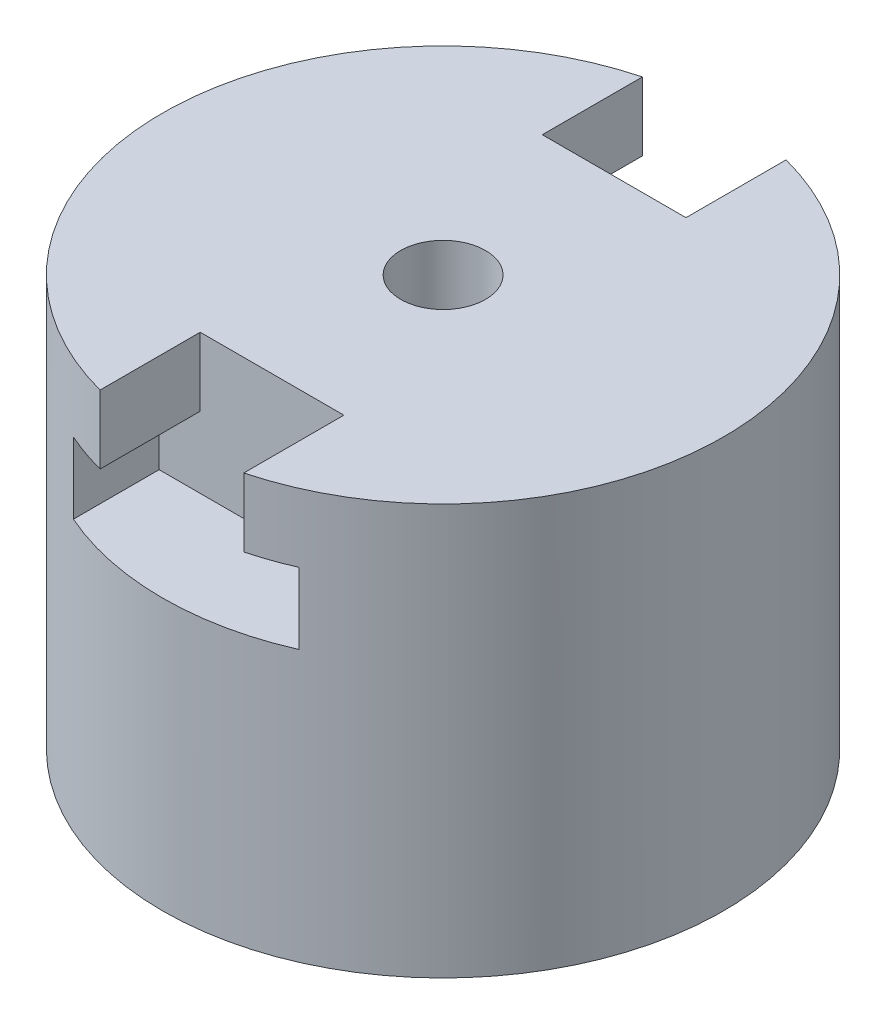
ISO-10303-21;
HEADER;
FILE_DESCRIPTION(('STEP AP214'),'2;1');
FILE_NAME('part.step','',(''),(''),'','','');
FILE_SCHEMA(('AUTOMOTIVE_DESIGN { 1 0 10303 214 1 1 1 1 }'));
ENDSEC;
DATA;
#1=APPLICATION_CONTEXT('core data for automotive mechanical design processes');
#2=APPLICATION_PROTOCOL_DEFINITION('international standard','automotive_design',2000,#1);
#3=PRODUCT_CONTEXT('',#1,'mechanical');
#4=PRODUCT('Part','Part','',(#3));
#5=PRODUCT_RELATED_PRODUCT_CATEGORY('part','',(#4));
#6=PRODUCT_DEFINITION_FORMATION('','',#4);
#7=PRODUCT_DEFINITION_CONTEXT('part definition',#1,'design');
#8=PRODUCT_DEFINITION('design','',#6,#7);
#9=PRODUCT_DEFINITION_SHAPE('','',#8);
#10=(LENGTH_UNIT() NAMED_UNIT(*) SI_UNIT(.MILLI.,.METRE.));
#11=(NAMED_UNIT(*) PLANE_ANGLE_UNIT() SI_UNIT($,.RADIAN.));
#12=(NAMED_UNIT(*) SI_UNIT($,.STERADIAN.) SOLID_ANGLE_UNIT());
#13=UNCERTAINTY_MEASURE_WITH_UNIT(LENGTH_MEASURE(1.E-05),#10,'distance_accuracy_value','');
#14=(GEOMETRIC_REPRESENTATION_CONTEXT(3) GLOBAL_UNCERTAINTY_ASSIGNED_CONTEXT((#13)) GLOBAL_UNIT_ASSIGNED_CONTEXT((#10,
#11,#12)) REPRESENTATION_CONTEXT('',''));
#15=CARTESIAN_POINT('',(0.,0.,0.));
#16=DIRECTION('',(0.,0.,1.));
#17=DIRECTION('',(1.,0.,0.));
#18=AXIS2_PLACEMENT_3D('',#15,#16,#17);
#19=CARTESIAN_POINT('',(0.,30.,0.));
#20=DIRECTION('',(0.,-1.,0.));
#21=DIRECTION('',(0.,0.,-1.));
#22=AXIS2_PLACEMENT_3D('',#19,#20,#21);
#23=CYLINDRICAL_SURFACE('',#22,20.5);
#24=CARTESIAN_POINT('',(0.,0.,0.));
#25=DIRECTION('',(0.,1.,0.));
#26=DIRECTION('',(0.,0.,1.));
#27=AXIS2_PLACEMENT_3D('',#24,#25,#26);
#28=CIRCLE('',#27,20.5);
#29=CARTESIAN_POINT('',(0.,0.,20.5));
#30=VERTEX_POINT('',#29);
#31=EDGE_CURVE('E250',#30,#30,#28,.T.);
#32=ORIENTED_EDGE('',*,*,#31,.T.);
#33=EDGE_LOOP('',(#32));
#34=FACE_BOUND('',#33,.T.);
#35=CARTESIAN_POINT('',(0.,19.8,0.));
#36=DIRECTION('',(0.,1.,0.));
#37=DIRECTION('',(0.,0.,1.));
#38=AXIS2_PLACEMENT_3D('',#35,#36,#37);
#39=CIRCLE('',#38,20.5);
#40=CARTESIAN_POINT('',(8.25,19.8,-18.7666592658363));
#41=VERTEX_POINT('',#40);
#42=CARTESIAN_POINT('',(-8.25,19.8,-18.7666592658363));
#43=VERTEX_POINT('',#42);
#44=EDGE_CURVE('E170',#41,#43,#39,.T.);
#45=ORIENTED_EDGE('',*,*,#44,.F.);
#46=DIRECTION('',(0.,-1.,0.));
#47=VECTOR('',#46,1.);
#48=CARTESIAN_POINT('',(8.25,30.,-18.7666592658363));
#49=LINE('',#48,#47);
#50=CARTESIAN_POINT('',(8.25,25.,-18.7666592658363));
#51=VERTEX_POINT('',#50);
#52=EDGE_CURVE('E11',#51,#41,#49,.T.);
#53=ORIENTED_EDGE('',*,*,#52,.F.);
#54=CARTESIAN_POINT('',(0.,25.,0.));
#55=DIRECTION('',(0.,-1.,0.));
#56=DIRECTION('',(0.,0.,-1.));
#57=AXIS2_PLACEMENT_3D('',#54,#55,#56);
#58=CIRCLE('',#57,20.5);
#59=CARTESIAN_POINT('',(5.25,25.,-19.8163442642683));
#60=VERTEX_POINT('',#59);
#61=EDGE_CURVE('E42',#60,#51,#58,.T.);
#62=ORIENTED_EDGE('',*,*,#61,.F.);
#63=DIRECTION('',(0.,-1.,0.));
#64=VECTOR('',#63,1.);
#65=CARTESIAN_POINT('',(5.25,30.,-19.8163442642683));
#66=LINE('',#65,#64);
#67=CARTESIAN_POINT('',(5.25,30.,-19.8163442642683));
#68=VERTEX_POINT('',#67);
#69=EDGE_CURVE('E174',#68,#60,#66,.T.);
#70=ORIENTED_EDGE('',*,*,#69,.F.);
#71=CARTESIAN_POINT('',(0.,30.,0.));
#72=DIRECTION('',(0.,1.,0.));
#73=DIRECTION('',(0.,0.,1.));
#74=AXIS2_PLACEMENT_3D('',#71,#72,#73);
#75=CIRCLE('',#74,20.5);
#76=CARTESIAN_POINT('',(5.25,30.,19.8163442642683));
#77=VERTEX_POINT('',#76);
#78=EDGE_CURVE('E253',#77,#68,#75,.T.);
#79=ORIENTED_EDGE('',*,*,#78,.F.);
#80=DIRECTION('',(0.,-1.,0.));
#81=VECTOR('',#80,1.);
#82=CARTESIAN_POINT('',(5.25,30.,19.8163442642683));
#83=LINE('',#82,#81);
#84=CARTESIAN_POINT('',(5.25,25.,19.8163442642683));
#85=VERTEX_POINT('',#84);
#86=EDGE_CURVE('E205',#77,#85,#83,.T.);
#87=ORIENTED_EDGE('',*,*,#86,.T.);
#88=CARTESIAN_POINT('',(0.,25.,0.));
#89=DIRECTION('',(0.,1.,0.));
#90=DIRECTION('',(0.,0.,1.));
#91=AXIS2_PLACEMENT_3D('',#88,#89,#90);
#92=CIRCLE('',#91,20.5);
#93=CARTESIAN_POINT('',(8.25,25.,18.7666592658363));
#94=VERTEX_POINT('',#93);
#95=EDGE_CURVE('E268',#85,#94,#92,.T.);
#96=ORIENTED_EDGE('',*,*,#95,.T.);
#97=DIRECTION('',(0.,-1.,0.));
#98=VECTOR('',#97,1.);
#99=CARTESIAN_POINT('',(8.25,30.,18.7666592658363));
#100=LINE('',#99,#98);
#101=CARTESIAN_POINT('',(8.25,19.8,18.7666592658363));
#102=VERTEX_POINT('',#101);
#103=EDGE_CURVE('E271',#94,#102,#100,.T.);
#104=ORIENTED_EDGE('',*,*,#103,.T.);
#105=CARTESIAN_POINT('',(0.,19.8,0.));
#106=DIRECTION('',(0.,-1.,0.));
#107=DIRECTION('',(0.,0.,-1.));
#108=AXIS2_PLACEMENT_3D('',#105,#106,#107);
#109=CIRCLE('',#108,20.5);
#110=CARTESIAN_POINT('',(-8.25,19.8,18.7666592658363));
#111=VERTEX_POINT('',#110);
#112=EDGE_CURVE('E256',#102,#111,#109,.T.);
#113=ORIENTED_EDGE('',*,*,#112,.T.);
#114=DIRECTION('',(0.,-1.,0.));
#115=VECTOR('',#114,1.);
#116=CARTESIAN_POINT('',(-8.25000000000001,30.,18.7666592658363));
#117=LINE('',#116,#115);
#118=CARTESIAN_POINT('',(-8.25,25.,18.7666592658363));
#119=VERTEX_POINT('',#118);
#120=EDGE_CURVE('E262',#111,#119,#117,.F.);
#121=ORIENTED_EDGE('',*,*,#120,.T.);
#122=CARTESIAN_POINT('',(0.,25.,0.));
#123=DIRECTION('',(0.,1.,0.));
#124=DIRECTION('',(0.,0.,1.));
#125=AXIS2_PLACEMENT_3D('',#122,#123,#124);
#126=CIRCLE('',#125,20.5);
#127=CARTESIAN_POINT('',(-5.25,25.,19.8163442642683));
#128=VERTEX_POINT('',#127);
#129=EDGE_CURVE('E265',#119,#128,#126,.T.);
#130=ORIENTED_EDGE('',*,*,#129,.T.);
#131=DIRECTION('',(0.,-1.,0.));
#132=VECTOR('',#131,1.);
#133=CARTESIAN_POINT('',(-5.25,30.,19.8163442642683));
#134=LINE('',#133,#132);
#135=CARTESIAN_POINT('',(-5.25,30.,19.8163442642683));
#136=VERTEX_POINT('',#135);
#137=EDGE_CURVE('E228',#128,#136,#134,.F.);
#138=ORIENTED_EDGE('',*,*,#137,.T.);
#139=CARTESIAN_POINT('',(-5.25,30.,-19.8163442642683));
#140=VERTEX_POINT('',#139);
#141=EDGE_CURVE('E257',#140,#136,#75,.T.);
#142=ORIENTED_EDGE('',*,*,#141,.F.);
#143=DIRECTION('',(0.,-1.,0.));
#144=VECTOR('',#143,1.);
#145=CARTESIAN_POINT('',(-5.25,30.,-19.8163442642683));
#146=LINE('',#145,#144);
#147=CARTESIAN_POINT('',(-5.25,25.,-19.8163442642683));
#148=VERTEX_POINT('',#147);
#149=EDGE_CURVE('E171',#148,#140,#146,.F.);
#150=ORIENTED_EDGE('',*,*,#149,.F.);
#151=CARTESIAN_POINT('',(0.,25.,0.));
#152=DIRECTION('',(0.,-1.,0.));
#153=DIRECTION('',(0.,0.,-1.));
#154=AXIS2_PLACEMENT_3D('',#151,#152,#153);
#155=CIRCLE('',#154,20.5);
#156=CARTESIAN_POINT('',(-8.25,25.,-18.7666592658363));
#157=VERTEX_POINT('',#156);
#158=EDGE_CURVE('E277',#157,#148,#155,.T.);
#159=ORIENTED_EDGE('',*,*,#158,.F.);
#160=DIRECTION('',(0.,-1.,0.));
#161=VECTOR('',#160,1.);
#162=CARTESIAN_POINT('',(-8.25,30.,-18.7666592658363));
#163=LINE('',#162,#161);
#164=EDGE_CURVE('E275',#43,#157,#163,.F.);
#165=ORIENTED_EDGE('',*,*,#164,.F.);
#166=EDGE_LOOP('',(#45,#53,#62,#70,#79,#87,#96,#104,#113,#121,#130,#138,#142,#150,#159,#165));
#167=FACE_BOUND('',#166,.T.);
#168=ADVANCED_FACE('F35',(#34,#167),#23,.T.);
#169=CARTESIAN_POINT('',(0.,30.,0.));
#170=DIRECTION('',(0.,1.,0.));
#171=DIRECTION('',(0.,0.,1.));
#172=AXIS2_PLACEMENT_3D('',#169,#170,#171);
#173=PLANE('',#172);
#174=CARTESIAN_POINT('',(0.,30.,0.));
#175=DIRECTION('',(0.,-1.,0.));
#176=DIRECTION('',(0.,0.,-1.));
#177=AXIS2_PLACEMENT_3D('',#174,#175,#176);
#178=CIRCLE('',#177,3.1);
#179=CARTESIAN_POINT('',(0.,30.,-3.1));
#180=VERTEX_POINT('',#179);
#181=EDGE_CURVE('E232',#180,#180,#178,.T.);
#182=ORIENTED_EDGE('',*,*,#181,.T.);
#183=EDGE_LOOP('',(#182));
#184=FACE_BOUND('',#183,.T.);
#185=ORIENTED_EDGE('',*,*,#78,.T.);
#186=DIRECTION('',(0.,0.,-1.));
#187=VECTOR('',#186,1.);
#188=CARTESIAN_POINT('',(5.25,30.,-12.5));
#189=LINE('',#188,#187);
#190=CARTESIAN_POINT('',(5.25,30.,-12.5));
#191=VERTEX_POINT('',#190);
#192=EDGE_CURVE('E307',#191,#68,#189,.T.);
#193=ORIENTED_EDGE('',*,*,#192,.F.);
#194=DIRECTION('',(-1.,0.,0.));
#195=VECTOR('',#194,1.);
#196=CARTESIAN_POINT('',(5.25,30.,-12.5));
#197=LINE('',#196,#195);
#198=CARTESIAN_POINT('',(-5.25,30.,-12.5));
#199=VERTEX_POINT('',#198);
#200=EDGE_CURVE('E340',#191,#199,#197,.T.);
#201=ORIENTED_EDGE('',*,*,#200,.T.);
#202=DIRECTION('',(0.,0.,-1.));
#203=VECTOR('',#202,1.);
#204=CARTESIAN_POINT('',(-5.25,30.,-12.5));
#205=LINE('',#204,#203);
#206=EDGE_CURVE('E300',#199,#140,#205,.T.);
#207=ORIENTED_EDGE('',*,*,#206,.T.);
#208=ORIENTED_EDGE('',*,*,#141,.T.);
#209=DIRECTION('',(0.,0.,1.));
#210=VECTOR('',#209,1.);
#211=CARTESIAN_POINT('',(-5.25,30.,12.5));
#212=LINE('',#211,#210);
#213=CARTESIAN_POINT('',(-5.25,30.,12.5));
#214=VERTEX_POINT('',#213);
#215=EDGE_CURVE('E215',#214,#136,#212,.T.);
#216=ORIENTED_EDGE('',*,*,#215,.F.);
#217=DIRECTION('',(-1.,0.,0.));
#218=VECTOR('',#217,1.);
#219=CARTESIAN_POINT('',(-5.25,30.,12.5));
#220=LINE('',#219,#218);
#221=CARTESIAN_POINT('',(5.25,30.,12.5));
#222=VERTEX_POINT('',#221);
#223=EDGE_CURVE('E187',#222,#214,#220,.T.);
#224=ORIENTED_EDGE('',*,*,#223,.F.);
#225=DIRECTION('',(0.,0.,1.));
#226=VECTOR('',#225,1.);
#227=CARTESIAN_POINT('',(5.25,30.,12.5));
#228=LINE('',#227,#226);
#229=EDGE_CURVE('E218',#222,#77,#228,.T.);
#230=ORIENTED_EDGE('',*,*,#229,.T.);
#231=EDGE_LOOP('',(#185,#193,#201,#207,#208,#216,#224,#230));
#232=FACE_BOUND('',#231,.T.);
#233=ADVANCED_FACE('F317',(#184,#232),#173,.T.);
#234=CARTESIAN_POINT('',(0.,0.,0.));
#235=DIRECTION('',(0.,1.,0.));
#236=DIRECTION('',(0.,0.,1.));
#237=AXIS2_PLACEMENT_3D('',#234,#235,#236);
#238=PLANE('',#237);
#239=CARTESIAN_POINT('',(0.,0.,0.));
#240=DIRECTION('',(0.,-1.,0.));
#241=DIRECTION('',(0.,0.,-1.));
#242=AXIS2_PLACEMENT_3D('',#239,#240,#241);
#243=CIRCLE('',#242,15.5);
#244=CARTESIAN_POINT('',(0.,0.,-15.5));
#245=VERTEX_POINT('',#244);
#246=EDGE_CURVE('E244',#245,#245,#243,.T.);
#247=ORIENTED_EDGE('',*,*,#246,.F.);
#248=EDGE_LOOP('',(#247));
#249=FACE_BOUND('',#248,.T.);
#250=ORIENTED_EDGE('',*,*,#31,.F.);
#251=EDGE_LOOP('',(#250));
#252=FACE_BOUND('',#251,.T.);
#253=ADVANCED_FACE('F362',(#249,#252),#238,.F.);
#254=CARTESIAN_POINT('',(0.,5.,0.));
#255=DIRECTION('',(0.,-1.,0.));
#256=DIRECTION('',(0.,0.,-1.));
#257=AXIS2_PLACEMENT_3D('',#254,#255,#256);
#258=CYLINDRICAL_SURFACE('',#257,15.5);
#259=CARTESIAN_POINT('',(0.,5.,0.));
#260=DIRECTION('',(0.,-1.,0.));
#261=DIRECTION('',(0.,0.,-1.));
#262=AXIS2_PLACEMENT_3D('',#259,#260,#261);
#263=CIRCLE('',#262,15.5);
#264=CARTESIAN_POINT('',(0.,5.,-15.5));
#265=VERTEX_POINT('',#264);
#266=EDGE_CURVE('E247',#265,#265,#263,.T.);
#267=ORIENTED_EDGE('',*,*,#266,.F.);
#268=EDGE_LOOP('',(#267));
#269=FACE_BOUND('',#268,.T.);
#270=ORIENTED_EDGE('',*,*,#246,.T.);
#271=EDGE_LOOP('',(#270));
#272=FACE_BOUND('',#271,.T.);
#273=ADVANCED_FACE('F368',(#269,#272),#258,.F.);
#274=CARTESIAN_POINT('',(0.,5.,0.));
#275=DIRECTION('',(0.,-1.,0.));
#276=DIRECTION('',(0.,0.,-1.));
#277=AXIS2_PLACEMENT_3D('',#274,#275,#276);
#278=PLANE('',#277);
#279=CARTESIAN_POINT('',(0.,5.,0.));
#280=DIRECTION('',(0.,-1.,0.));
#281=DIRECTION('',(0.,0.,-1.));
#282=AXIS2_PLACEMENT_3D('',#279,#280,#281);
#283=CIRCLE('',#282,12.);
#284=CARTESIAN_POINT('',(0.,5.,-12.));
#285=VERTEX_POINT('',#284);
#286=EDGE_CURVE('E241',#285,#285,#283,.T.);
#287=ORIENTED_EDGE('',*,*,#286,.F.);
#288=EDGE_LOOP('',(#287));
#289=FACE_BOUND('',#288,.T.);
#290=ORIENTED_EDGE('',*,*,#266,.T.);
#291=EDGE_LOOP('',(#290));
#292=FACE_BOUND('',#291,.T.);
#293=ADVANCED_FACE('F374',(#289,#292),#278,.T.);
#294=CARTESIAN_POINT('',(0.,5.,0.));
#295=DIRECTION('',(0.,-1.,0.));
#296=DIRECTION('',(0.,0.,-1.));
#297=AXIS2_PLACEMENT_3D('',#294,#295,#296);
#298=CYLINDRICAL_SURFACE('',#297,12.);
#299=ORIENTED_EDGE('',*,*,#286,.T.);
#300=EDGE_LOOP('',(#299));
#301=FACE_BOUND('',#300,.T.);
#302=CARTESIAN_POINT('',(0.,0.,0.));
#303=DIRECTION('',(0.,-1.,0.));
#304=DIRECTION('',(0.,0.,-1.));
#305=AXIS2_PLACEMENT_3D('',#302,#303,#304);
#306=CIRCLE('',#305,12.);
#307=CARTESIAN_POINT('',(0.,0.,-12.));
#308=VERTEX_POINT('',#307);
#309=EDGE_CURVE('E240',#308,#308,#306,.T.);
#310=ORIENTED_EDGE('',*,*,#309,.F.);
#311=EDGE_LOOP('',(#310));
#312=FACE_BOUND('',#311,.T.);
#313=ADVANCED_FACE('F380',(#301,#312),#298,.T.);
#314=CARTESIAN_POINT('',(0.,0.,0.));
#315=DIRECTION('',(0.,-1.,0.));
#316=DIRECTION('',(0.,0.,-1.));
#317=AXIS2_PLACEMENT_3D('',#314,#315,#316);
#318=CIRCLE('',#317,11.5);
#319=CARTESIAN_POINT('',(0.,0.,-11.5));
#320=VERTEX_POINT('',#319);
#321=EDGE_CURVE('E235',#320,#320,#318,.T.);
#322=ORIENTED_EDGE('',*,*,#321,.F.);
#323=EDGE_LOOP('',(#322));
#324=FACE_BOUND('',#323,.T.);
#325=ORIENTED_EDGE('',*,*,#309,.T.);
#326=EDGE_LOOP('',(#325));
#327=FACE_BOUND('',#326,.T.);
#328=ADVANCED_FACE('F370',(#324,#327),#238,.F.);
#329=CARTESIAN_POINT('',(0.,0.,0.));
#330=DIRECTION('',(0.,-1.,0.));
#331=DIRECTION('',(0.,0.,-1.));
#332=AXIS2_PLACEMENT_3D('',#329,#330,#331);
#333=CONICAL_SURFACE('',#332,11.5,0.633054644159695);
#334=CARTESIAN_POINT('',(0.,11.4472030307825,0.));
#335=DIRECTION('',(0.,-1.,0.));
#336=DIRECTION('',(0.,0.,-1.));
#337=AXIS2_PLACEMENT_3D('',#334,#335,#336);
#338=CIRCLE('',#337,3.1);
#339=CARTESIAN_POINT('',(0.,11.4472030307825,-3.1));
#340=VERTEX_POINT('',#339);
#341=EDGE_CURVE('E231',#340,#340,#338,.T.);
#342=CARTESIAN_POINT('',(0.,11.4472030307825,-3.1));
#343=CARTESIAN_POINT('',(0.,11.3279613325452,-3.1875));
#344=CARTESIAN_POINT('',(0.,11.2087196343079,-3.275));
#345=CARTESIAN_POINT('',(0.,10.9702362378332,-3.45));
#346=CARTESIAN_POINT('',(0.,10.8509945395959,-3.5375));
#347=CARTESIAN_POINT('',(0.,10.6125111431213,-3.7125));
#348=CARTESIAN_POINT('',(0.,10.4932694448839,-3.8));
#349=CARTESIAN_POINT('',(0.,10.2547860484093,-3.975));
#350=CARTESIAN_POINT('',(0.,10.135544350172,-4.0625));
#351=CARTESIAN_POINT('',(0.,9.89706095369736,-4.2375));
#352=CARTESIAN_POINT('',(0.,9.77781925546004,-4.325));
#353=CARTESIAN_POINT('',(0.,9.53933585898541,-4.5));
#354=CARTESIAN_POINT('',(0.,9.42009416074809,-4.5875));
#355=CARTESIAN_POINT('',(0.,9.18161076427345,-4.7625));
#356=CARTESIAN_POINT('',(0.,9.06236906603614,-4.85));
#357=CARTESIAN_POINT('',(0.,8.8238856695615,-5.025));
#358=CARTESIAN_POINT('',(0.,8.70464397132418,-5.1125));
#359=CARTESIAN_POINT('',(0.,8.46616057484955,-5.2875));
#360=CARTESIAN_POINT('',(0.,8.34691887661223,-5.375));
#361=CARTESIAN_POINT('',(0.,8.1084354801376,-5.55));
#362=CARTESIAN_POINT('',(0.,7.98919378190028,-5.6375));
#363=CARTESIAN_POINT('',(0.,7.75071038542564,-5.8125));
#364=CARTESIAN_POINT('',(0.,7.63146868718832,-5.9));
#365=CARTESIAN_POINT('',(0.,7.39298529071369,-6.075));
#366=CARTESIAN_POINT('',(0.,7.27374359247637,-6.1625));
#367=CARTESIAN_POINT('',(0.,7.03526019600174,-6.3375));
#368=CARTESIAN_POINT('',(0.,6.91601849776442,-6.425));
#369=CARTESIAN_POINT('',(0.,6.67753510128978,-6.6));
#370=CARTESIAN_POINT('',(0.,6.55829340305247,-6.6875));
#371=CARTESIAN_POINT('',(0.,6.31981000657783,-6.8625));
#372=CARTESIAN_POINT('',(0.,6.20056830834051,-6.95));
#373=CARTESIAN_POINT('',(0.,5.96208491186588,-7.125));
#374=CARTESIAN_POINT('',(0.,5.84284321362856,-7.2125));
#375=CARTESIAN_POINT('',(0.,5.60435981715393,-7.3875));
#376=CARTESIAN_POINT('',(0.,5.48511811891661,-7.475));
#377=CARTESIAN_POINT('',(0.,5.24663472244197,-7.65));
#378=CARTESIAN_POINT('',(0.,5.12739302420466,-7.7375));
#379=CARTESIAN_POINT('',(0.,4.88890962773002,-7.9125));
#380=CARTESIAN_POINT('',(0.,4.7696679294927,-8.));
#381=CARTESIAN_POINT('',(0.,4.53118453301807,-8.175));
#382=CARTESIAN_POINT('',(0.,4.41194283478075,-8.2625));
#383=CARTESIAN_POINT('',(0.,4.17345943830611,-8.4375));
#384=CARTESIAN_POINT('',(0.,4.0542177400688,-8.525));
#385=CARTESIAN_POINT('',(0.,3.81573434359416,-8.7));
#386=CARTESIAN_POINT('',(0.,3.69649264535684,-8.7875));
#387=CARTESIAN_POINT('',(0.,3.45800924888221,-8.9625));
#388=CARTESIAN_POINT('',(0.,3.33876755064489,-9.05));
#389=CARTESIAN_POINT('',(0.,3.10028415417026,-9.225));
#390=CARTESIAN_POINT('',(0.,2.98104245593294,-9.3125));
#391=CARTESIAN_POINT('',(0.,2.7425590594583,-9.4875));
#392=CARTESIAN_POINT('',(0.,2.62331736122099,-9.575));
#393=CARTESIAN_POINT('',(0.,2.38483396474635,-9.75));
#394=CARTESIAN_POINT('',(0.,2.26559226650903,-9.8375));
#395=CARTESIAN_POINT('',(0.,2.0271088700344,-10.0125));
#396=CARTESIAN_POINT('',(0.,1.90786717179708,-10.1));
#397=CARTESIAN_POINT('',(0.,1.66938377532245,-10.275));
#398=CARTESIAN_POINT('',(0.,1.55014207708513,-10.3625));
#399=CARTESIAN_POINT('',(0.,1.31165868061049,-10.5375));
#400=CARTESIAN_POINT('',(0.,1.19241698237318,-10.625));
#401=CARTESIAN_POINT('',(0.,0.95393358589854,-10.8));
#402=CARTESIAN_POINT('',(0.,0.834691887661223,-10.8875));
#403=CARTESIAN_POINT('',(0.,0.596208491186588,-11.0625));
#404=CARTESIAN_POINT('',(0.,0.47696679294927,-11.15));
#405=CARTESIAN_POINT('',(0.,0.238483396474635,-11.325));
#406=CARTESIAN_POINT('',(0.,0.119241698237318,-11.4125));
#407=CARTESIAN_POINT('',(0.,0.,-11.5));
#408=B_SPLINE_CURVE_WITH_KNOTS('',3,(#342,#343,#344,#345,#346,#347,#348,#349,#350,#351,#352,
#353,#354,#355,#356,#357,#358,#359,#360,#361,#362,#363,#364,#365,#366,#367,#368,#369,#370,#371,
#372,#373,#374,#375,#376,#377,#378,#379,#380,#381,#382,#383,#384,#385,#386,#387,#388,#389,#390,
#391,#392,#393,#394,#395,#396,#397,#398,#399,#400,#401,#402,#403,#404,#405,#406,#407),
.UNSPECIFIED.,.F.,.F.,(4,2,2,2,2,2,2,2,2,2,2,2,2,2,2,2,2,2,2,2,2,2,2,2,2,2,2,2,2,2,2,2,4),(0.,
0.443704285968342,0.887408571936682,1.33111285790502,1.77481714387337,2.21852142984171,
2.66222571581005,3.10593000177839,3.54963428774673,3.99333857371507,4.43704285968341,
4.88074714565175,5.32445143162009,5.76815571758844,6.21186000355678,6.65556428952512,
7.09926857549346,7.5429728614618,7.98667714743014,8.43038143339848,8.87408571936682,
9.31779000533516,9.7614942913035,10.2051985772718,10.6489028632402,11.0926071492085,
11.5363114351769,11.9800157211452,12.4237200071136,12.8674242930819,13.3111285790502,
13.7548328650186,14.1985371509869),.UNSPECIFIED.);
#409=EDGE_CURVE('BSEAM379',#340,#320,#408,.T.);
#410=ORIENTED_EDGE('',*,*,#341,.F.);
#411=ORIENTED_EDGE('',*,*,#321,.T.);
#412=ORIENTED_EDGE('',*,*,#409,.T.);
#413=ORIENTED_EDGE('',*,*,#409,.F.);
#414=EDGE_LOOP('',(#410,#412,#411,#413));
#415=FACE_BOUND('',#414,.T.);
#416=ADVANCED_FACE('F379',(#415),#333,.F.);
#417=CARTESIAN_POINT('',(0.,30.,0.));
#418=DIRECTION('',(0.,-1.,0.));
#419=DIRECTION('',(0.,0.,-1.));
#420=AXIS2_PLACEMENT_3D('',#417,#418,#419);
#421=CYLINDRICAL_SURFACE('',#420,3.1);
#422=ORIENTED_EDGE('',*,*,#181,.F.);
#423=EDGE_LOOP('',(#422));
#424=FACE_BOUND('',#423,.T.);
#425=ORIENTED_EDGE('',*,*,#341,.T.);
#426=EDGE_LOOP('',(#425));
#427=FACE_BOUND('',#426,.T.);
#428=ADVANCED_FACE('F386',(#424,#427),#421,.F.);
#429=CARTESIAN_POINT('',(8.25,25.,12.5));
#430=DIRECTION('',(1.,0.,0.));
#431=DIRECTION('',(0.,0.,-1.));
#432=AXIS2_PLACEMENT_3D('',#429,#430,#431);
#433=PLANE('',#432);
#434=DIRECTION('',(0.,0.,1.));
#435=VECTOR('',#434,1.);
#436=CARTESIAN_POINT('',(8.25,25.,12.5));
#437=LINE('',#436,#435);
#438=CARTESIAN_POINT('',(8.25,25.,12.5));
#439=VERTEX_POINT('',#438);
#440=EDGE_CURVE('E201',#439,#94,#437,.T.);
#441=ORIENTED_EDGE('',*,*,#440,.F.);
#442=DIRECTION('',(0.,1.,0.));
#443=VECTOR('',#442,1.);
#444=CARTESIAN_POINT('',(8.25,25.,12.5));
#445=LINE('',#444,#443);
#446=CARTESIAN_POINT('',(8.25,19.8,12.5));
#447=VERTEX_POINT('',#446);
#448=EDGE_CURVE('E181',#447,#439,#445,.T.);
#449=ORIENTED_EDGE('',*,*,#448,.F.);
#450=DIRECTION('',(0.,0.,1.));
#451=VECTOR('',#450,1.);
#452=CARTESIAN_POINT('',(8.25,19.8,12.5));
#453=LINE('',#452,#451);
#454=EDGE_CURVE('E202',#447,#102,#453,.T.);
#455=ORIENTED_EDGE('',*,*,#454,.T.);
#456=ORIENTED_EDGE('',*,*,#103,.F.);
#457=EDGE_LOOP('',(#441,#449,#455,#456));
#458=FACE_BOUND('',#457,.T.);
#459=ADVANCED_FACE('F327',(#458),#433,.F.);
#460=CARTESIAN_POINT('',(-8.25,19.8,12.5));
#461=DIRECTION('',(0.,-1.,0.));
#462=DIRECTION('',(0.,0.,-1.));
#463=AXIS2_PLACEMENT_3D('',#460,#461,#462);
#464=PLANE('',#463);
#465=ORIENTED_EDGE('',*,*,#454,.F.);
#466=DIRECTION('',(1.,0.,0.));
#467=VECTOR('',#466,1.);
#468=CARTESIAN_POINT('',(-8.25,19.8,12.5));
#469=LINE('',#468,#467);
#470=CARTESIAN_POINT('',(-8.25,19.8,12.5));
#471=VERTEX_POINT('',#470);
#472=EDGE_CURVE('E198',#471,#447,#469,.T.);
#473=ORIENTED_EDGE('',*,*,#472,.F.);
#474=DIRECTION('',(0.,0.,1.));
#475=VECTOR('',#474,1.);
#476=CARTESIAN_POINT('',(-8.25,19.8,12.5));
#477=LINE('',#476,#475);
#478=EDGE_CURVE('E206',#471,#111,#477,.T.);
#479=ORIENTED_EDGE('',*,*,#478,.T.);
#480=ORIENTED_EDGE('',*,*,#112,.F.);
#481=EDGE_LOOP('',(#465,#473,#479,#480));
#482=FACE_BOUND('',#481,.T.);
#483=ADVANCED_FACE('F330',(#482),#464,.F.);
#484=CARTESIAN_POINT('',(-8.25,25.,12.5));
#485=DIRECTION('',(-1.,0.,0.));
#486=DIRECTION('',(0.,-1.,0.));
#487=AXIS2_PLACEMENT_3D('',#484,#485,#486);
#488=PLANE('',#487);
#489=ORIENTED_EDGE('',*,*,#478,.F.);
#490=DIRECTION('',(0.,-1.,0.));
#491=VECTOR('',#490,1.);
#492=CARTESIAN_POINT('',(-8.25,25.,12.5));
#493=LINE('',#492,#491);
#494=CARTESIAN_POINT('',(-8.25,25.,12.5));
#495=VERTEX_POINT('',#494);
#496=EDGE_CURVE('E195',#495,#471,#493,.T.);
#497=ORIENTED_EDGE('',*,*,#496,.F.);
#498=DIRECTION('',(0.,0.,1.));
#499=VECTOR('',#498,1.);
#500=CARTESIAN_POINT('',(-8.25,25.,12.5));
#501=LINE('',#500,#499);
#502=EDGE_CURVE('E209',#495,#119,#501,.T.);
#503=ORIENTED_EDGE('',*,*,#502,.T.);
#504=ORIENTED_EDGE('',*,*,#120,.F.);
#505=EDGE_LOOP('',(#489,#497,#503,#504));
#506=FACE_BOUND('',#505,.T.);
#507=ADVANCED_FACE('F332',(#506),#488,.F.);
#508=CARTESIAN_POINT('',(-8.25,25.,12.5));
#509=DIRECTION('',(0.,1.,0.));
#510=DIRECTION('',(0.,0.,1.));
#511=AXIS2_PLACEMENT_3D('',#508,#509,#510);
#512=PLANE('',#511);
#513=ORIENTED_EDGE('',*,*,#502,.F.);
#514=DIRECTION('',(-1.,0.,0.));
#515=VECTOR('',#514,1.);
#516=CARTESIAN_POINT('',(-8.25,25.,12.5));
#517=LINE('',#516,#515);
#518=CARTESIAN_POINT('',(-5.25,25.,12.5));
#519=VERTEX_POINT('',#518);
#520=EDGE_CURVE('E192',#519,#495,#517,.T.);
#521=ORIENTED_EDGE('',*,*,#520,.F.);
#522=DIRECTION('',(0.,0.,1.));
#523=VECTOR('',#522,1.);
#524=CARTESIAN_POINT('',(-5.25,25.,12.5));
#525=LINE('',#524,#523);
#526=EDGE_CURVE('E212',#519,#128,#525,.T.);
#527=ORIENTED_EDGE('',*,*,#526,.T.);
#528=ORIENTED_EDGE('',*,*,#129,.F.);
#529=EDGE_LOOP('',(#513,#521,#527,#528));
#530=FACE_BOUND('',#529,.T.);
#531=ADVANCED_FACE('F336',(#530),#512,.F.);
#532=CARTESIAN_POINT('',(8.25,25.,12.5));
#533=DIRECTION('',(0.,1.,0.));
#534=DIRECTION('',(0.,0.,1.));
#535=AXIS2_PLACEMENT_3D('',#532,#533,#534);
#536=PLANE('',#535);
#537=DIRECTION('',(0.,0.,1.));
#538=VECTOR('',#537,1.);
#539=CARTESIAN_POINT('',(5.25,25.,12.5));
#540=LINE('',#539,#538);
#541=CARTESIAN_POINT('',(5.25,25.,12.5));
#542=VERTEX_POINT('',#541);
#543=EDGE_CURVE('E221',#542,#85,#540,.T.);
#544=ORIENTED_EDGE('',*,*,#543,.F.);
#545=DIRECTION('',(-1.,0.,0.));
#546=VECTOR('',#545,1.);
#547=CARTESIAN_POINT('',(8.25,25.,12.5));
#548=LINE('',#547,#546);
#549=EDGE_CURVE('E184',#439,#542,#548,.T.);
#550=ORIENTED_EDGE('',*,*,#549,.F.);
#551=ORIENTED_EDGE('',*,*,#440,.T.);
#552=ORIENTED_EDGE('',*,*,#95,.F.);
#553=EDGE_LOOP('',(#544,#550,#551,#552));
#554=FACE_BOUND('',#553,.T.);
#555=ADVANCED_FACE('F323',(#554),#536,.F.);
#556=CARTESIAN_POINT('',(-5.25,30.,12.5));
#557=DIRECTION('',(-1.,0.,0.));
#558=DIRECTION('',(0.,0.,1.));
#559=AXIS2_PLACEMENT_3D('',#556,#557,#558);
#560=PLANE('',#559);
#561=ORIENTED_EDGE('',*,*,#526,.F.);
#562=DIRECTION('',(0.,-1.,0.));
#563=VECTOR('',#562,1.);
#564=CARTESIAN_POINT('',(-5.25,30.,12.5));
#565=LINE('',#564,#563);
#566=EDGE_CURVE('E189',#214,#519,#565,.T.);
#567=ORIENTED_EDGE('',*,*,#566,.F.);
#568=ORIENTED_EDGE('',*,*,#215,.T.);
#569=ORIENTED_EDGE('',*,*,#137,.F.);
#570=EDGE_LOOP('',(#561,#567,#568,#569));
#571=FACE_BOUND('',#570,.T.);
#572=ADVANCED_FACE('F338',(#571),#560,.F.);
#573=CARTESIAN_POINT('',(5.25,30.,12.5));
#574=DIRECTION('',(1.,0.,0.));
#575=DIRECTION('',(0.,1.,0.));
#576=AXIS2_PLACEMENT_3D('',#573,#574,#575);
#577=PLANE('',#576);
#578=ORIENTED_EDGE('',*,*,#229,.F.);
#579=DIRECTION('',(0.,1.,0.));
#580=VECTOR('',#579,1.);
#581=CARTESIAN_POINT('',(5.25,30.,12.5));
#582=LINE('',#581,#580);
#583=EDGE_CURVE('E57',#542,#222,#582,.T.);
#584=ORIENTED_EDGE('',*,*,#583,.F.);
#585=ORIENTED_EDGE('',*,*,#543,.T.);
#586=ORIENTED_EDGE('',*,*,#86,.F.);
#587=EDGE_LOOP('',(#578,#584,#585,#586));
#588=FACE_BOUND('',#587,.T.);
#589=ADVANCED_FACE('F321',(#588),#577,.F.);
#590=CARTESIAN_POINT('',(0.,0.,12.5));
#591=DIRECTION('',(0.,0.,1.));
#592=DIRECTION('',(1.,0.,0.));
#593=AXIS2_PLACEMENT_3D('',#590,#591,#592);
#594=PLANE('',#593);
#595=ORIENTED_EDGE('',*,*,#448,.T.);
#596=ORIENTED_EDGE('',*,*,#549,.T.);
#597=ORIENTED_EDGE('',*,*,#583,.T.);
#598=ORIENTED_EDGE('',*,*,#223,.T.);
#599=ORIENTED_EDGE('',*,*,#566,.T.);
#600=ORIENTED_EDGE('',*,*,#520,.T.);
#601=ORIENTED_EDGE('',*,*,#496,.T.);
#602=ORIENTED_EDGE('',*,*,#472,.T.);
#603=EDGE_LOOP('',(#595,#596,#597,#598,#599,#600,#601,#602));
#604=FACE_BOUND('',#603,.T.);
#605=ADVANCED_FACE('F411',(#604),#594,.T.);
#606=CARTESIAN_POINT('',(-8.25,25.,-12.5));
#607=DIRECTION('',(1.,0.,0.));
#608=DIRECTION('',(0.,1.,0.));
#609=AXIS2_PLACEMENT_3D('',#606,#607,#608);
#610=PLANE('',#609);
#611=ORIENTED_EDGE('',*,*,#164,.T.);
#612=DIRECTION('',(0.,0.,-1.));
#613=VECTOR('',#612,1.);
#614=CARTESIAN_POINT('',(-8.25,25.,-12.5));
#615=LINE('',#614,#613);
#616=CARTESIAN_POINT('',(-8.25,25.,-12.5));
#617=VERTEX_POINT('',#616);
#618=EDGE_CURVE('E167',#617,#157,#615,.T.);
#619=ORIENTED_EDGE('',*,*,#618,.F.);
#620=DIRECTION('',(0.,-1.,0.));
#621=VECTOR('',#620,1.);
#622=CARTESIAN_POINT('',(-8.25,25.,-12.5));
#623=LINE('',#622,#621);
#624=CARTESIAN_POINT('',(-8.25,19.8,-12.5));
#625=VERTEX_POINT('',#624);
#626=EDGE_CURVE('E152',#617,#625,#623,.T.);
#627=ORIENTED_EDGE('',*,*,#626,.T.);
#628=DIRECTION('',(0.,0.,-1.));
#629=VECTOR('',#628,1.);
#630=CARTESIAN_POINT('',(-8.25,19.8,-12.5));
#631=LINE('',#630,#629);
#632=EDGE_CURVE('E164',#625,#43,#631,.T.);
#633=ORIENTED_EDGE('',*,*,#632,.T.);
#634=EDGE_LOOP('',(#611,#619,#627,#633));
#635=FACE_BOUND('',#634,.T.);
#636=ADVANCED_FACE('F163',(#635),#610,.T.);
#637=CARTESIAN_POINT('',(8.25,19.8,-12.5));
#638=DIRECTION('',(0.,1.,0.));
#639=DIRECTION('',(0.,0.,1.));
#640=AXIS2_PLACEMENT_3D('',#637,#638,#639);
#641=PLANE('',#640);
#642=DIRECTION('',(0.,0.,-1.));
#643=VECTOR('',#642,1.);
#644=CARTESIAN_POINT('',(8.25,19.8,-12.5));
#645=LINE('',#644,#643);
#646=CARTESIAN_POINT('',(8.25,19.8,-12.5));
#647=VERTEX_POINT('',#646);
#648=EDGE_CURVE('E172',#647,#41,#645,.T.);
#649=ORIENTED_EDGE('',*,*,#648,.T.);
#650=ORIENTED_EDGE('',*,*,#44,.T.);
#651=ORIENTED_EDGE('',*,*,#632,.F.);
#652=DIRECTION('',(1.,0.,0.));
#653=VECTOR('',#652,1.);
#654=CARTESIAN_POINT('',(8.25,19.8,-12.5));
#655=LINE('',#654,#653);
#656=EDGE_CURVE('E149',#625,#647,#655,.T.);
#657=ORIENTED_EDGE('',*,*,#656,.T.);
#658=EDGE_LOOP('',(#649,#650,#651,#657));
#659=FACE_BOUND('',#658,.T.);
#660=ADVANCED_FACE('F169',(#659),#641,.T.);
#661=CARTESIAN_POINT('',(8.25,25.,-12.5));
#662=DIRECTION('',(-1.,0.,0.));
#663=DIRECTION('',(0.,-1.,0.));
#664=AXIS2_PLACEMENT_3D('',#661,#662,#663);
#665=PLANE('',#664);
#666=ORIENTED_EDGE('',*,*,#52,.T.);
#667=ORIENTED_EDGE('',*,*,#648,.F.);
#668=DIRECTION('',(0.,1.,0.));
#669=VECTOR('',#668,1.);
#670=CARTESIAN_POINT('',(8.25,25.,-12.5));
#671=LINE('',#670,#669);
#672=CARTESIAN_POINT('',(8.25,25.,-12.5));
#673=VERTEX_POINT('',#672);
#674=EDGE_CURVE('E154',#647,#673,#671,.T.);
#675=ORIENTED_EDGE('',*,*,#674,.T.);
#676=DIRECTION('',(0.,0.,-1.));
#677=VECTOR('',#676,1.);
#678=CARTESIAN_POINT('',(8.25,25.,-12.5));
#679=LINE('',#678,#677);
#680=EDGE_CURVE('E176',#673,#51,#679,.T.);
#681=ORIENTED_EDGE('',*,*,#680,.T.);
#682=EDGE_LOOP('',(#666,#667,#675,#681));
#683=FACE_BOUND('',#682,.T.);
#684=ADVANCED_FACE('F290',(#683),#665,.T.);
#685=CARTESIAN_POINT('',(8.25,25.,-12.5));
#686=DIRECTION('',(0.,-1.,0.));
#687=DIRECTION('',(0.,0.,-1.));
#688=AXIS2_PLACEMENT_3D('',#685,#686,#687);
#689=PLANE('',#688);
#690=ORIENTED_EDGE('',*,*,#61,.T.);
#691=ORIENTED_EDGE('',*,*,#680,.F.);
#692=DIRECTION('',(-1.,0.,0.));
#693=VECTOR('',#692,1.);
#694=CARTESIAN_POINT('',(8.25,25.,-12.5));
#695=LINE('',#694,#693);
#696=CARTESIAN_POINT('',(5.25,25.,-12.5));
#697=VERTEX_POINT('',#696);
#698=EDGE_CURVE('E346',#673,#697,#695,.T.);
#699=ORIENTED_EDGE('',*,*,#698,.T.);
#700=DIRECTION('',(0.,0.,-1.));
#701=VECTOR('',#700,1.);
#702=CARTESIAN_POINT('',(5.25,25.,-12.5));
#703=LINE('',#702,#701);
#704=EDGE_CURVE('E285',#697,#60,#703,.T.);
#705=ORIENTED_EDGE('',*,*,#704,.T.);
#706=EDGE_LOOP('',(#690,#691,#699,#705));
#707=FACE_BOUND('',#706,.T.);
#708=ADVANCED_FACE('F283',(#707),#689,.T.);
#709=CARTESIAN_POINT('',(-8.25,25.,-12.5));
#710=DIRECTION('',(0.,-1.,0.));
#711=DIRECTION('',(0.,0.,-1.));
#712=AXIS2_PLACEMENT_3D('',#709,#710,#711);
#713=PLANE('',#712);
#714=ORIENTED_EDGE('',*,*,#158,.T.);
#715=DIRECTION('',(0.,0.,-1.));
#716=VECTOR('',#715,1.);
#717=CARTESIAN_POINT('',(-5.25,25.,-12.5));
#718=LINE('',#717,#716);
#719=CARTESIAN_POINT('',(-5.25,25.,-12.5));
#720=VERTEX_POINT('',#719);
#721=EDGE_CURVE('E298',#720,#148,#718,.T.);
#722=ORIENTED_EDGE('',*,*,#721,.F.);
#723=DIRECTION('',(-1.,0.,0.));
#724=VECTOR('',#723,1.);
#725=CARTESIAN_POINT('',(-8.25,25.,-12.5));
#726=LINE('',#725,#724);
#727=EDGE_CURVE('E297',#720,#617,#726,.T.);
#728=ORIENTED_EDGE('',*,*,#727,.T.);
#729=ORIENTED_EDGE('',*,*,#618,.T.);
#730=EDGE_LOOP('',(#714,#722,#728,#729));
#731=FACE_BOUND('',#730,.T.);
#732=ADVANCED_FACE('F294',(#731),#713,.T.);
#733=CARTESIAN_POINT('',(5.25,30.,-12.5));
#734=DIRECTION('',(-1.,0.,0.));
#735=DIRECTION('',(0.,0.,1.));
#736=AXIS2_PLACEMENT_3D('',#733,#734,#735);
#737=PLANE('',#736);
#738=ORIENTED_EDGE('',*,*,#69,.T.);
#739=ORIENTED_EDGE('',*,*,#704,.F.);
#740=DIRECTION('',(0.,1.,0.));
#741=VECTOR('',#740,1.);
#742=CARTESIAN_POINT('',(5.25,30.,-12.5));
#743=LINE('',#742,#741);
#744=EDGE_CURVE('E313',#697,#191,#743,.T.);
#745=ORIENTED_EDGE('',*,*,#744,.T.);
#746=ORIENTED_EDGE('',*,*,#192,.T.);
#747=EDGE_LOOP('',(#738,#739,#745,#746));
#748=FACE_BOUND('',#747,.T.);
#749=ADVANCED_FACE('F311',(#748),#737,.T.);
#750=CARTESIAN_POINT('',(-5.25,30.,-12.5));
#751=DIRECTION('',(1.,0.,0.));
#752=DIRECTION('',(0.,1.,0.));
#753=AXIS2_PLACEMENT_3D('',#750,#751,#752);
#754=PLANE('',#753);
#755=ORIENTED_EDGE('',*,*,#149,.T.);
#756=ORIENTED_EDGE('',*,*,#206,.F.);
#757=DIRECTION('',(0.,-1.,0.));
#758=VECTOR('',#757,1.);
#759=CARTESIAN_POINT('',(-5.25,30.,-12.5));
#760=LINE('',#759,#758);
#761=EDGE_CURVE('E49',#199,#720,#760,.T.);
#762=ORIENTED_EDGE('',*,*,#761,.T.);
#763=ORIENTED_EDGE('',*,*,#721,.T.);
#764=EDGE_LOOP('',(#755,#756,#762,#763));
#765=FACE_BOUND('',#764,.T.);
#766=ADVANCED_FACE('F342',(#765),#754,.T.);
#767=CARTESIAN_POINT('',(0.,0.,-12.5));
#768=DIRECTION('',(0.,0.,-1.));
#769=DIRECTION('',(-1.,0.,0.));
#770=AXIS2_PLACEMENT_3D('',#767,#768,#769);
#771=PLANE('',#770);
#772=ORIENTED_EDGE('',*,*,#626,.F.);
#773=ORIENTED_EDGE('',*,*,#727,.F.);
#774=ORIENTED_EDGE('',*,*,#761,.F.);
#775=ORIENTED_EDGE('',*,*,#200,.F.);
#776=ORIENTED_EDGE('',*,*,#744,.F.);
#777=ORIENTED_EDGE('',*,*,#698,.F.);
#778=ORIENTED_EDGE('',*,*,#674,.F.);
#779=ORIENTED_EDGE('',*,*,#656,.F.);
#780=EDGE_LOOP('',(#772,#773,#774,#775,#776,#777,#778,#779));
#781=FACE_BOUND('',#780,.T.);
#782=ADVANCED_FACE('F151',(#781),#771,.T.);
#783=CLOSED_SHELL('',(#168,#233,#253,#273,#293,#313,#328,#416,#428,#459,#483,#507,#531,#555,
#572,#589,#605,#636,#660,#684,#708,#732,#749,#766,#782));
#784=MANIFOLD_SOLID_BREP('B2',#783);
#785=ADVANCED_BREP_SHAPE_REPRESENTATION('',(#18,#784),#14);
#786=SHAPE_DEFINITION_REPRESENTATION(#9,#785);
ENDSEC;
END-ISO-10303-21;
